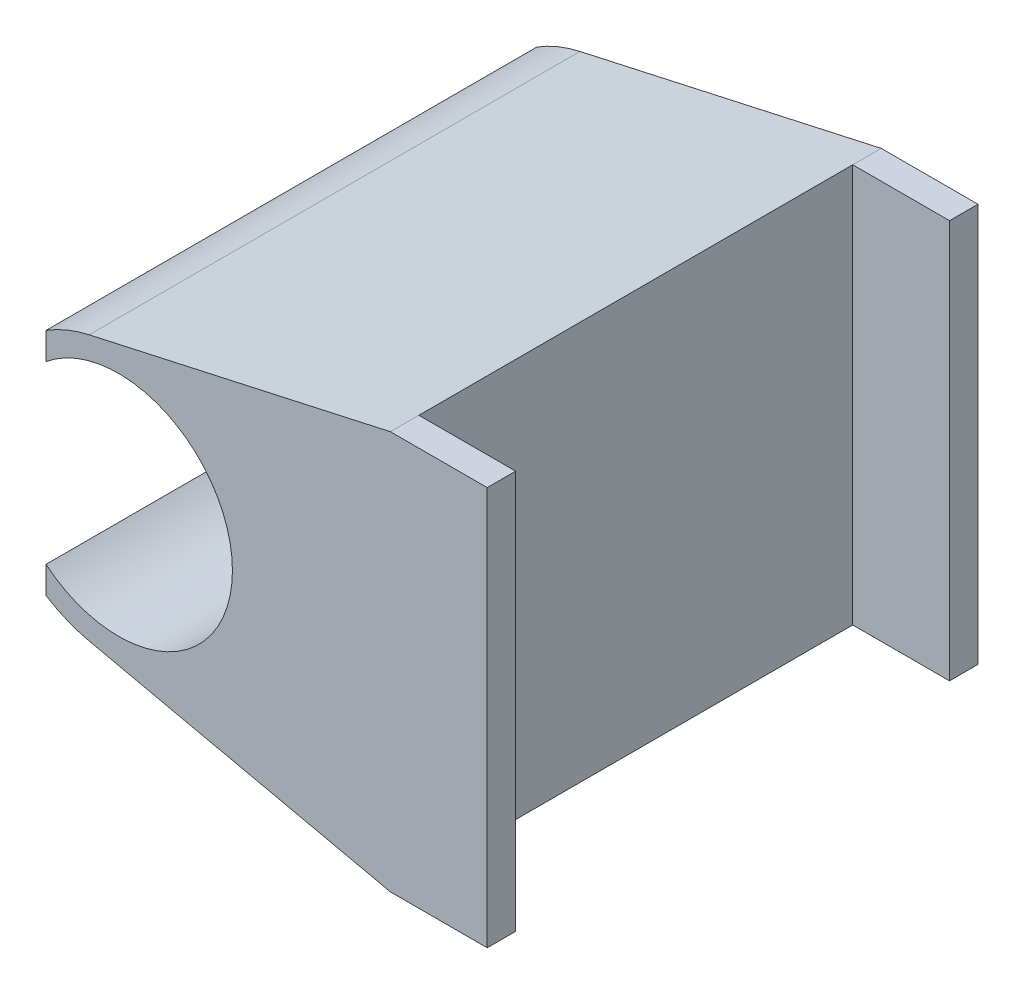
ISO-10303-21;
HEADER;
FILE_DESCRIPTION(('STEP AP214'),'2;1');
FILE_NAME('part.step','',(''),(''),'','','');
FILE_SCHEMA(('AUTOMOTIVE_DESIGN { 1 0 10303 214 1 1 1 1 }'));
ENDSEC;
DATA;
#1=APPLICATION_CONTEXT('core data for automotive mechanical design processes');
#2=APPLICATION_PROTOCOL_DEFINITION('international standard','automotive_design',2000,#1);
#3=PRODUCT_CONTEXT('',#1,'mechanical');
#4=PRODUCT('Part','Part','',(#3));
#5=PRODUCT_RELATED_PRODUCT_CATEGORY('part','',(#4));
#6=PRODUCT_DEFINITION_FORMATION('','',#4);
#7=PRODUCT_DEFINITION_CONTEXT('part definition',#1,'design');
#8=PRODUCT_DEFINITION('design','',#6,#7);
#9=PRODUCT_DEFINITION_SHAPE('','',#8);
#10=(LENGTH_UNIT() NAMED_UNIT(*) SI_UNIT(.MILLI.,.METRE.));
#11=(NAMED_UNIT(*) PLANE_ANGLE_UNIT() SI_UNIT($,.RADIAN.));
#12=(NAMED_UNIT(*) SI_UNIT($,.STERADIAN.) SOLID_ANGLE_UNIT());
#13=UNCERTAINTY_MEASURE_WITH_UNIT(LENGTH_MEASURE(1.E-05),#10,'distance_accuracy_value','');
#14=(GEOMETRIC_REPRESENTATION_CONTEXT(3) GLOBAL_UNCERTAINTY_ASSIGNED_CONTEXT((#13)) GLOBAL_UNIT_ASSIGNED_CONTEXT((#10,
#11,#12)) REPRESENTATION_CONTEXT('',''));
#15=CARTESIAN_POINT('',(0.,0.,0.));
#16=DIRECTION('',(0.,0.,1.));
#17=DIRECTION('',(1.,0.,0.));
#18=AXIS2_PLACEMENT_3D('',#15,#16,#17);
#19=CARTESIAN_POINT('',(0.,35.,-29.2719512195122));
#20=DIRECTION('',(0.,0.,1.));
#21=DIRECTION('',(1.,0.,0.));
#22=AXIS2_PLACEMENT_3D('',#19,#20,#21);
#23=PLANE('',#22);
#24=DIRECTION('',(0.976356305138745,-0.216167447632194,0.));
#25=VECTOR('',#24,1.);
#26=CARTESIAN_POINT('',(-0.397191106034449,-1.79397982892226,-29.2719512195122));
#27=LINE('',#26,#25);
#28=CARTESIAN_POINT('',(-34.9528481587726,5.85671914954375,-29.2719512195122));
#29=VERTEX_POINT('',#28);
#30=CARTESIAN_POINT('',(-8.50000000000001,0.,-29.2719512195122));
#31=VERTEX_POINT('',#30);
#32=EDGE_CURVE('E175',#29,#31,#27,.T.);
#33=ORIENTED_EDGE('',*,*,#32,.F.);
#34=CARTESIAN_POINT('',(-32.375,17.5,-29.2719512195122));
#35=DIRECTION('',(0.,0.,1.));
#36=DIRECTION('',(1.,0.,0.));
#37=AXIS2_PLACEMENT_3D('',#34,#35,#36);
#38=CIRCLE('',#37,11.9252375277094);
#39=CARTESIAN_POINT('',(-38.7462449709904,7.41939844989802,-29.2719512195122));
#40=VERTEX_POINT('',#39);
#41=EDGE_CURVE('E188',#40,#29,#38,.T.);
#42=ORIENTED_EDGE('',*,*,#41,.F.);
#43=DIRECTION('',(0.,1.,0.));
#44=VECTOR('',#43,1.);
#45=CARTESIAN_POINT('',(-38.7462449709904,0.,-29.2719512195122));
#46=LINE('',#45,#44);
#47=CARTESIAN_POINT('',(-38.7462449709904,9.79239093365331,-29.2719512195122));
#48=VERTEX_POINT('',#47);
#49=EDGE_CURVE('E190',#40,#48,#46,.T.);
#50=ORIENTED_EDGE('',*,*,#49,.T.);
#51=CARTESIAN_POINT('',(-32.375,17.5,-29.2719512195122));
#52=DIRECTION('',(0.,0.,1.));
#53=DIRECTION('',(1.,0.,0.));
#54=AXIS2_PLACEMENT_3D('',#51,#52,#53);
#55=CIRCLE('',#54,9.99999999999999);
#56=CARTESIAN_POINT('',(-38.7462449709904,25.2076090663467,-29.2719512195122));
#57=VERTEX_POINT('',#56);
#58=EDGE_CURVE('E193',#48,#57,#55,.T.);
#59=ORIENTED_EDGE('',*,*,#58,.T.);
#60=DIRECTION('',(0.,1.,0.));
#61=VECTOR('',#60,1.);
#62=CARTESIAN_POINT('',(-38.7462449709904,0.,-29.2719512195122));
#63=LINE('',#62,#61);
#64=CARTESIAN_POINT('',(-38.7462449709904,27.580601550102,-29.2719512195122));
#65=VERTEX_POINT('',#64);
#66=EDGE_CURVE('E166',#57,#65,#63,.T.);
#67=ORIENTED_EDGE('',*,*,#66,.T.);
#68=CARTESIAN_POINT('',(-32.375,17.5,-29.2719512195122));
#69=DIRECTION('',(0.,0.,1.));
#70=DIRECTION('',(1.,0.,0.));
#71=AXIS2_PLACEMENT_3D('',#68,#69,#70);
#72=CIRCLE('',#71,11.9252375277094);
#73=CARTESIAN_POINT('',(-34.9528481587726,29.1432808504563,-29.2719512195122));
#74=VERTEX_POINT('',#73);
#75=EDGE_CURVE('E159',#74,#65,#72,.T.);
#76=ORIENTED_EDGE('',*,*,#75,.F.);
#77=DIRECTION('',(0.976356305138745,0.216167447632194,0.));
#78=VECTOR('',#77,1.);
#79=CARTESIAN_POINT('',(-7.78416687218494,35.1584870393687,-29.2719512195122));
#80=LINE('',#79,#78);
#81=CARTESIAN_POINT('',(-8.49999999999991,35.,-29.2719512195122));
#82=VERTEX_POINT('',#81);
#83=EDGE_CURVE('E169',#74,#82,#80,.T.);
#84=ORIENTED_EDGE('',*,*,#83,.T.);
#85=DIRECTION('',(-1.,0.,0.));
#86=VECTOR('',#85,1.);
#87=CARTESIAN_POINT('',(0.,35.,-29.2719512195122));
#88=LINE('',#87,#86);
#89=CARTESIAN_POINT('',(0.,35.,-29.2719512195122));
#90=VERTEX_POINT('',#89);
#91=EDGE_CURVE('E227',#90,#82,#88,.T.);
#92=ORIENTED_EDGE('',*,*,#91,.F.);
#93=DIRECTION('',(0.,-1.,0.));
#94=VECTOR('',#93,1.);
#95=CARTESIAN_POINT('',(0.,35.,-29.2719512195122));
#96=LINE('',#95,#94);
#97=CARTESIAN_POINT('',(0.,0.,-29.2719512195122));
#98=VERTEX_POINT('',#97);
#99=EDGE_CURVE('E260',#90,#98,#96,.T.);
#100=ORIENTED_EDGE('',*,*,#99,.T.);
#101=DIRECTION('',(-1.,0.,0.));
#102=VECTOR('',#101,1.);
#103=CARTESIAN_POINT('',(0.,0.,-29.2719512195122));
#104=LINE('',#103,#102);
#105=EDGE_CURVE('E241',#98,#31,#104,.T.);
#106=ORIENTED_EDGE('',*,*,#105,.T.);
#107=EDGE_LOOP('',(#33,#42,#50,#59,#67,#76,#84,#92,#100,#106));
#108=FACE_BOUND('',#107,.T.);
#109=ADVANCED_FACE('F45',(#108),#23,.F.);
#110=CARTESIAN_POINT('',(-42.375,35.,13.8280487804878));
#111=DIRECTION('',(0.,0.,-1.));
#112=DIRECTION('',(-1.,0.,0.));
#113=AXIS2_PLACEMENT_3D('',#110,#111,#112);
#114=PLANE('',#113);
#115=DIRECTION('',(0.976356305138745,-0.216167447632194,0.));
#116=VECTOR('',#115,1.);
#117=CARTESIAN_POINT('',(-0.397191106034449,-1.79397982892226,13.8280487804878));
#118=LINE('',#117,#116);
#119=CARTESIAN_POINT('',(-34.9528481587726,5.85671914954375,13.8280487804878));
#120=VERTEX_POINT('',#119);
#121=CARTESIAN_POINT('',(-8.50000000000001,0.,13.8280487804878));
#122=VERTEX_POINT('',#121);
#123=EDGE_CURVE('E199',#120,#122,#118,.T.);
#124=ORIENTED_EDGE('',*,*,#123,.T.);
#125=DIRECTION('',(1.,0.,0.));
#126=VECTOR('',#125,1.);
#127=CARTESIAN_POINT('',(-42.375,0.,13.8280487804878));
#128=LINE('',#127,#126);
#129=CARTESIAN_POINT('',(0.,0.,13.8280487804878));
#130=VERTEX_POINT('',#129);
#131=EDGE_CURVE('E244',#122,#130,#128,.T.);
#132=ORIENTED_EDGE('',*,*,#131,.T.);
#133=DIRECTION('',(0.,-1.,0.));
#134=VECTOR('',#133,1.);
#135=CARTESIAN_POINT('',(0.,35.,13.8280487804878));
#136=LINE('',#135,#134);
#137=CARTESIAN_POINT('',(0.,35.,13.8280487804878));
#138=VERTEX_POINT('',#137);
#139=EDGE_CURVE('E258',#138,#130,#136,.T.);
#140=ORIENTED_EDGE('',*,*,#139,.F.);
#141=DIRECTION('',(1.,0.,0.));
#142=VECTOR('',#141,1.);
#143=CARTESIAN_POINT('',(-42.375,35.,13.8280487804878));
#144=LINE('',#143,#142);
#145=CARTESIAN_POINT('',(-8.49999999999991,35.,13.8280487804878));
#146=VERTEX_POINT('',#145);
#147=EDGE_CURVE('E229',#146,#138,#144,.T.);
#148=ORIENTED_EDGE('',*,*,#147,.F.);
#149=DIRECTION('',(0.976356305138745,0.216167447632194,0.));
#150=VECTOR('',#149,1.);
#151=CARTESIAN_POINT('',(-7.78416687218494,35.1584870393687,13.8280487804878));
#152=LINE('',#151,#150);
#153=CARTESIAN_POINT('',(-34.9528481587726,29.1432808504563,13.8280487804878));
#154=VERTEX_POINT('',#153);
#155=EDGE_CURVE('E197',#154,#146,#152,.T.);
#156=ORIENTED_EDGE('',*,*,#155,.F.);
#157=CARTESIAN_POINT('',(-32.375,17.5,13.8280487804878));
#158=DIRECTION('',(0.,0.,1.));
#159=DIRECTION('',(1.,0.,0.));
#160=AXIS2_PLACEMENT_3D('',#157,#158,#159);
#161=CIRCLE('',#160,11.9252375277094);
#162=CARTESIAN_POINT('',(-38.7462449709904,27.580601550102,13.8280487804878));
#163=VERTEX_POINT('',#162);
#164=EDGE_CURVE('E162',#154,#163,#161,.T.);
#165=ORIENTED_EDGE('',*,*,#164,.T.);
#166=DIRECTION('',(0.,1.,0.));
#167=VECTOR('',#166,1.);
#168=CARTESIAN_POINT('',(-38.7462449709904,0.,13.8280487804878));
#169=LINE('',#168,#167);
#170=CARTESIAN_POINT('',(-38.7462449709904,25.2076090663467,13.8280487804878));
#171=VERTEX_POINT('',#170);
#172=EDGE_CURVE('E181',#171,#163,#169,.T.);
#173=ORIENTED_EDGE('',*,*,#172,.F.);
#174=CARTESIAN_POINT('',(-32.375,17.5,13.8280487804878));
#175=DIRECTION('',(0.,0.,1.));
#176=DIRECTION('',(1.,0.,0.));
#177=AXIS2_PLACEMENT_3D('',#174,#175,#176);
#178=CIRCLE('',#177,9.99999999999999);
#179=CARTESIAN_POINT('',(-38.7462449709904,9.79239093365331,13.8280487804878));
#180=VERTEX_POINT('',#179);
#181=EDGE_CURVE('E184',#180,#171,#178,.T.);
#182=ORIENTED_EDGE('',*,*,#181,.F.);
#183=DIRECTION('',(0.,1.,0.));
#184=VECTOR('',#183,1.);
#185=CARTESIAN_POINT('',(-38.7462449709904,0.,13.8280487804878));
#186=LINE('',#185,#184);
#187=CARTESIAN_POINT('',(-38.7462449709904,7.41939844989802,13.8280487804878));
#188=VERTEX_POINT('',#187);
#189=EDGE_CURVE('E205',#188,#180,#186,.T.);
#190=ORIENTED_EDGE('',*,*,#189,.F.);
#191=CARTESIAN_POINT('',(-32.375,17.5,13.8280487804878));
#192=DIRECTION('',(0.,0.,1.));
#193=DIRECTION('',(1.,0.,0.));
#194=AXIS2_PLACEMENT_3D('',#191,#192,#193);
#195=CIRCLE('',#194,11.9252375277094);
#196=EDGE_CURVE('E202',#188,#120,#195,.T.);
#197=ORIENTED_EDGE('',*,*,#196,.T.);
#198=EDGE_LOOP('',(#124,#132,#140,#148,#156,#165,#173,#182,#190,#197));
#199=FACE_BOUND('',#198,.T.);
#200=ADVANCED_FACE('F271',(#199),#114,.F.);
#201=CARTESIAN_POINT('',(0.,35.,0.));
#202=DIRECTION('',(0.,1.,0.));
#203=DIRECTION('',(0.,0.,1.));
#204=AXIS2_PLACEMENT_3D('',#201,#202,#203);
#205=PLANE('',#204);
#206=DIRECTION('',(0.,0.,-1.));
#207=VECTOR('',#206,1.);
#208=CARTESIAN_POINT('',(-8.49999999999999,35.,0.));
#209=LINE('',#208,#207);
#210=CARTESIAN_POINT('',(-8.49999999999991,35.,11.3280487804878));
#211=VERTEX_POINT('',#210);
#212=EDGE_CURVE('E11',#146,#211,#209,.T.);
#213=ORIENTED_EDGE('',*,*,#212,.F.);
#214=ORIENTED_EDGE('',*,*,#147,.T.);
#215=DIRECTION('',(0.,0.,-1.));
#216=VECTOR('',#215,1.);
#217=CARTESIAN_POINT('',(0.,35.,13.8280487804878));
#218=LINE('',#217,#216);
#219=CARTESIAN_POINT('',(0.,35.,11.3280487804878));
#220=VERTEX_POINT('',#219);
#221=EDGE_CURVE('E62',#138,#220,#218,.T.);
#222=ORIENTED_EDGE('',*,*,#221,.T.);
#223=DIRECTION('',(-1.,0.,0.));
#224=VECTOR('',#223,1.);
#225=CARTESIAN_POINT('',(0.,35.,11.3280487804878));
#226=LINE('',#225,#224);
#227=EDGE_CURVE('E232',#220,#211,#226,.T.);
#228=ORIENTED_EDGE('',*,*,#227,.T.);
#229=EDGE_LOOP('',(#213,#214,#222,#228));
#230=FACE_BOUND('',#229,.T.);
#231=ADVANCED_FACE('F308',(#230),#205,.T.);
#232=CARTESIAN_POINT('',(0.,0.,0.));
#233=DIRECTION('',(0.,1.,0.));
#234=DIRECTION('',(0.,0.,1.));
#235=AXIS2_PLACEMENT_3D('',#232,#233,#234);
#236=PLANE('',#235);
#237=DIRECTION('',(0.,0.,1.));
#238=VECTOR('',#237,1.);
#239=CARTESIAN_POINT('',(-8.50000000000001,0.,-29.2719512195122));
#240=LINE('',#239,#238);
#241=CARTESIAN_POINT('',(-8.50000000000001,0.,-26.7719512195122));
#242=VERTEX_POINT('',#241);
#243=EDGE_CURVE('E221',#31,#242,#240,.T.);
#244=ORIENTED_EDGE('',*,*,#243,.F.);
#245=ORIENTED_EDGE('',*,*,#105,.F.);
#246=DIRECTION('',(0.,0.,-1.));
#247=VECTOR('',#246,1.);
#248=CARTESIAN_POINT('',(0.,0.,-26.7719512195122));
#249=LINE('',#248,#247);
#250=CARTESIAN_POINT('',(0.,0.,-26.7719512195122));
#251=VERTEX_POINT('',#250);
#252=EDGE_CURVE('E239',#251,#98,#249,.T.);
#253=ORIENTED_EDGE('',*,*,#252,.F.);
#254=DIRECTION('',(1.,0.,0.));
#255=VECTOR('',#254,1.);
#256=CARTESIAN_POINT('',(-8.5,0.,-26.7719512195122));
#257=LINE('',#256,#255);
#258=EDGE_CURVE('E212',#242,#251,#257,.T.);
#259=ORIENTED_EDGE('',*,*,#258,.F.);
#260=EDGE_LOOP('',(#244,#245,#253,#259));
#261=FACE_BOUND('',#260,.T.);
#262=ADVANCED_FACE('F292',(#261),#236,.F.);
#263=DIRECTION('',(0.,0.,1.));
#264=VECTOR('',#263,1.);
#265=CARTESIAN_POINT('',(-8.50000000000001,0.,0.));
#266=LINE('',#265,#264);
#267=CARTESIAN_POINT('',(-8.5,0.,11.3280487804878));
#268=VERTEX_POINT('',#267);
#269=EDGE_CURVE('E54',#268,#122,#266,.T.);
#270=ORIENTED_EDGE('',*,*,#269,.F.);
#271=DIRECTION('',(-1.,0.,0.));
#272=VECTOR('',#271,1.);
#273=CARTESIAN_POINT('',(0.,0.,11.3280487804878));
#274=LINE('',#273,#272);
#275=CARTESIAN_POINT('',(0.,0.,11.3280487804878));
#276=VERTEX_POINT('',#275);
#277=EDGE_CURVE('E247',#276,#268,#274,.T.);
#278=ORIENTED_EDGE('',*,*,#277,.F.);
#279=DIRECTION('',(0.,0.,-1.));
#280=VECTOR('',#279,1.);
#281=CARTESIAN_POINT('',(0.,0.,13.8280487804878));
#282=LINE('',#281,#280);
#283=EDGE_CURVE('E82',#130,#276,#282,.T.);
#284=ORIENTED_EDGE('',*,*,#283,.F.);
#285=ORIENTED_EDGE('',*,*,#131,.F.);
#286=EDGE_LOOP('',(#270,#278,#284,#285));
#287=FACE_BOUND('',#286,.T.);
#288=ADVANCED_FACE('F275',(#287),#236,.F.);
#289=CARTESIAN_POINT('',(-8.5,35.,-26.7719512195122));
#290=DIRECTION('',(0.,0.,-1.));
#291=DIRECTION('',(-1.,0.,0.));
#292=AXIS2_PLACEMENT_3D('',#289,#290,#291);
#293=PLANE('',#292);
#294=ORIENTED_EDGE('',*,*,#258,.T.);
#295=DIRECTION('',(0.,-1.,0.));
#296=VECTOR('',#295,1.);
#297=CARTESIAN_POINT('',(0.,35.,-26.7719512195122));
#298=LINE('',#297,#296);
#299=CARTESIAN_POINT('',(0.,35.,-26.7719512195122));
#300=VERTEX_POINT('',#299);
#301=EDGE_CURVE('E263',#300,#251,#298,.T.);
#302=ORIENTED_EDGE('',*,*,#301,.F.);
#303=DIRECTION('',(1.,0.,0.));
#304=VECTOR('',#303,1.);
#305=CARTESIAN_POINT('',(-8.5,35.,-26.7719512195122));
#306=LINE('',#305,#304);
#307=CARTESIAN_POINT('',(-8.49999999999991,35.,-26.7719512195122));
#308=VERTEX_POINT('',#307);
#309=EDGE_CURVE('E224',#308,#300,#306,.T.);
#310=ORIENTED_EDGE('',*,*,#309,.F.);
#311=DIRECTION('',(0.,-1.,0.));
#312=VECTOR('',#311,1.);
#313=CARTESIAN_POINT('',(-8.5,35.,-26.7719512195122));
#314=LINE('',#313,#312);
#315=EDGE_CURVE('E236',#308,#242,#314,.T.);
#316=ORIENTED_EDGE('',*,*,#315,.T.);
#317=EDGE_LOOP('',(#294,#302,#310,#316));
#318=FACE_BOUND('',#317,.T.);
#319=ADVANCED_FACE('F47',(#318),#293,.F.);
#320=CARTESIAN_POINT('',(0.,35.,-26.7719512195122));
#321=DIRECTION('',(-1.,0.,0.));
#322=DIRECTION('',(0.,0.,1.));
#323=AXIS2_PLACEMENT_3D('',#320,#321,#322);
#324=PLANE('',#323);
#325=ORIENTED_EDGE('',*,*,#252,.T.);
#326=ORIENTED_EDGE('',*,*,#99,.F.);
#327=DIRECTION('',(0.,0.,-1.));
#328=VECTOR('',#327,1.);
#329=CARTESIAN_POINT('',(0.,35.,-26.7719512195122));
#330=LINE('',#329,#328);
#331=EDGE_CURVE('E98',#300,#90,#330,.T.);
#332=ORIENTED_EDGE('',*,*,#331,.F.);
#333=ORIENTED_EDGE('',*,*,#301,.T.);
#334=EDGE_LOOP('',(#325,#326,#332,#333));
#335=FACE_BOUND('',#334,.T.);
#336=ADVANCED_FACE('F311',(#335),#324,.F.);
#337=CARTESIAN_POINT('',(0.,35.,13.8280487804878));
#338=DIRECTION('',(-1.,0.,0.));
#339=DIRECTION('',(0.,0.,1.));
#340=AXIS2_PLACEMENT_3D('',#337,#338,#339);
#341=PLANE('',#340);
#342=ORIENTED_EDGE('',*,*,#283,.T.);
#343=DIRECTION('',(0.,-1.,0.));
#344=VECTOR('',#343,1.);
#345=CARTESIAN_POINT('',(0.,35.,11.3280487804878));
#346=LINE('',#345,#344);
#347=EDGE_CURVE('E256',#220,#276,#346,.T.);
#348=ORIENTED_EDGE('',*,*,#347,.F.);
#349=ORIENTED_EDGE('',*,*,#221,.F.);
#350=ORIENTED_EDGE('',*,*,#139,.T.);
#351=EDGE_LOOP('',(#342,#348,#349,#350));
#352=FACE_BOUND('',#351,.T.);
#353=ADVANCED_FACE('F309',(#352),#341,.F.);
#354=CARTESIAN_POINT('',(0.,35.,11.3280487804878));
#355=DIRECTION('',(0.,0.,1.));
#356=DIRECTION('',(1.,0.,0.));
#357=AXIS2_PLACEMENT_3D('',#354,#355,#356);
#358=PLANE('',#357);
#359=ORIENTED_EDGE('',*,*,#277,.T.);
#360=DIRECTION('',(0.,-1.,0.));
#361=VECTOR('',#360,1.);
#362=CARTESIAN_POINT('',(-8.5,35.,11.3280487804878));
#363=LINE('',#362,#361);
#364=EDGE_CURVE('E253',#211,#268,#363,.T.);
#365=ORIENTED_EDGE('',*,*,#364,.F.);
#366=ORIENTED_EDGE('',*,*,#227,.F.);
#367=ORIENTED_EDGE('',*,*,#347,.T.);
#368=EDGE_LOOP('',(#359,#365,#366,#367));
#369=FACE_BOUND('',#368,.T.);
#370=ADVANCED_FACE('F278',(#369),#358,.F.);
#371=CARTESIAN_POINT('',(-8.5,35.,11.3280487804878));
#372=DIRECTION('',(-1.,0.,0.));
#373=DIRECTION('',(0.,0.,1.));
#374=AXIS2_PLACEMENT_3D('',#371,#372,#373);
#375=PLANE('',#374);
#376=DIRECTION('',(0.,0.,-1.));
#377=VECTOR('',#376,1.);
#378=CARTESIAN_POINT('',(-8.5,0.,11.3280487804878));
#379=LINE('',#378,#377);
#380=EDGE_CURVE('E90',#268,#242,#379,.T.);
#381=ORIENTED_EDGE('',*,*,#380,.T.);
#382=ORIENTED_EDGE('',*,*,#315,.F.);
#383=DIRECTION('',(0.,0.,-1.));
#384=VECTOR('',#383,1.);
#385=CARTESIAN_POINT('',(-8.5,35.,11.3280487804878));
#386=LINE('',#385,#384);
#387=EDGE_CURVE('E234',#211,#308,#386,.T.);
#388=ORIENTED_EDGE('',*,*,#387,.F.);
#389=ORIENTED_EDGE('',*,*,#364,.T.);
#390=EDGE_LOOP('',(#381,#382,#388,#389));
#391=FACE_BOUND('',#390,.T.);
#392=ADVANCED_FACE('F282',(#391),#375,.F.);
#393=DIRECTION('',(0.,0.,1.));
#394=VECTOR('',#393,1.);
#395=CARTESIAN_POINT('',(-8.49999999999991,35.,-29.2719512195122));
#396=LINE('',#395,#394);
#397=EDGE_CURVE('E165',#82,#308,#396,.T.);
#398=ORIENTED_EDGE('',*,*,#397,.T.);
#399=ORIENTED_EDGE('',*,*,#309,.T.);
#400=ORIENTED_EDGE('',*,*,#331,.T.);
#401=ORIENTED_EDGE('',*,*,#91,.T.);
#402=EDGE_LOOP('',(#398,#399,#400,#401));
#403=FACE_BOUND('',#402,.T.);
#404=ADVANCED_FACE('F287',(#403),#205,.T.);
#405=CARTESIAN_POINT('',(-32.375,17.5,-29.2719512195122));
#406=DIRECTION('',(0.,0.,1.));
#407=DIRECTION('',(1.,0.,0.));
#408=AXIS2_PLACEMENT_3D('',#405,#406,#407);
#409=CYLINDRICAL_SURFACE('',#408,11.9252375277094);
#410=ORIENTED_EDGE('',*,*,#164,.F.);
#411=DIRECTION('',(0.,0.,1.));
#412=VECTOR('',#411,1.);
#413=CARTESIAN_POINT('',(-34.9528481587726,29.1432808504563,-29.2719512195122));
#414=LINE('',#413,#412);
#415=EDGE_CURVE('E155',#74,#154,#414,.T.);
#416=ORIENTED_EDGE('',*,*,#415,.F.);
#417=ORIENTED_EDGE('',*,*,#75,.T.);
#418=DIRECTION('',(0.,0.,1.));
#419=VECTOR('',#418,1.);
#420=CARTESIAN_POINT('',(-38.7462449709904,27.580601550102,-29.2719512195122));
#421=LINE('',#420,#419);
#422=EDGE_CURVE('E210',#65,#163,#421,.T.);
#423=ORIENTED_EDGE('',*,*,#422,.T.);
#424=EDGE_LOOP('',(#410,#416,#417,#423));
#425=FACE_BOUND('',#424,.T.);
#426=ADVANCED_FACE('F157',(#425),#409,.T.);
#427=CARTESIAN_POINT('',(-38.7462449709904,0.,-29.2719512195122));
#428=DIRECTION('',(1.,0.,0.));
#429=DIRECTION('',(0.,0.,-1.));
#430=AXIS2_PLACEMENT_3D('',#427,#428,#429);
#431=PLANE('',#430);
#432=ORIENTED_EDGE('',*,*,#172,.T.);
#433=ORIENTED_EDGE('',*,*,#422,.F.);
#434=ORIENTED_EDGE('',*,*,#66,.F.);
#435=DIRECTION('',(0.,0.,1.));
#436=VECTOR('',#435,1.);
#437=CARTESIAN_POINT('',(-38.7462449709904,25.2076090663467,-29.2719512195122));
#438=LINE('',#437,#436);
#439=EDGE_CURVE('E213',#57,#171,#438,.T.);
#440=ORIENTED_EDGE('',*,*,#439,.T.);
#441=EDGE_LOOP('',(#432,#433,#434,#440));
#442=FACE_BOUND('',#441,.T.);
#443=ADVANCED_FACE('F306',(#442),#431,.F.);
#444=CARTESIAN_POINT('',(-32.375,17.5,-29.2719512195122));
#445=DIRECTION('',(0.,0.,1.));
#446=DIRECTION('',(1.,0.,0.));
#447=AXIS2_PLACEMENT_3D('',#444,#445,#446);
#448=CYLINDRICAL_SURFACE('',#447,9.99999999999999);
#449=ORIENTED_EDGE('',*,*,#181,.T.);
#450=ORIENTED_EDGE('',*,*,#439,.F.);
#451=ORIENTED_EDGE('',*,*,#58,.F.);
#452=DIRECTION('',(0.,0.,1.));
#453=VECTOR('',#452,1.);
#454=CARTESIAN_POINT('',(-38.7462449709904,9.79239093365331,-29.2719512195122));
#455=LINE('',#454,#453);
#456=EDGE_CURVE('E215',#48,#180,#455,.T.);
#457=ORIENTED_EDGE('',*,*,#456,.T.);
#458=EDGE_LOOP('',(#449,#450,#451,#457));
#459=FACE_BOUND('',#458,.T.);
#460=ADVANCED_FACE('F303',(#459),#448,.F.);
#461=CARTESIAN_POINT('',(-38.7462449709904,0.,-29.2719512195122));
#462=DIRECTION('',(1.,0.,0.));
#463=DIRECTION('',(0.,0.,-1.));
#464=AXIS2_PLACEMENT_3D('',#461,#462,#463);
#465=PLANE('',#464);
#466=ORIENTED_EDGE('',*,*,#189,.T.);
#467=ORIENTED_EDGE('',*,*,#456,.F.);
#468=ORIENTED_EDGE('',*,*,#49,.F.);
#469=DIRECTION('',(0.,0.,1.));
#470=VECTOR('',#469,1.);
#471=CARTESIAN_POINT('',(-38.7462449709904,7.41939844989802,-29.2719512195122));
#472=LINE('',#471,#470);
#473=EDGE_CURVE('E217',#40,#188,#472,.T.);
#474=ORIENTED_EDGE('',*,*,#473,.T.);
#475=EDGE_LOOP('',(#466,#467,#468,#474));
#476=FACE_BOUND('',#475,.T.);
#477=ADVANCED_FACE('F299',(#476),#465,.F.);
#478=CARTESIAN_POINT('',(-32.375,17.5,-29.2719512195122));
#479=DIRECTION('',(0.,0.,1.));
#480=DIRECTION('',(1.,0.,0.));
#481=AXIS2_PLACEMENT_3D('',#478,#479,#480);
#482=CYLINDRICAL_SURFACE('',#481,11.9252375277094);
#483=ORIENTED_EDGE('',*,*,#196,.F.);
#484=ORIENTED_EDGE('',*,*,#473,.F.);
#485=ORIENTED_EDGE('',*,*,#41,.T.);
#486=DIRECTION('',(0.,0.,1.));
#487=VECTOR('',#486,1.);
#488=CARTESIAN_POINT('',(-34.9528481587726,5.85671914954375,-29.2719512195122));
#489=LINE('',#488,#487);
#490=EDGE_CURVE('E219',#29,#120,#489,.T.);
#491=ORIENTED_EDGE('',*,*,#490,.T.);
#492=EDGE_LOOP('',(#483,#484,#485,#491));
#493=FACE_BOUND('',#492,.T.);
#494=ADVANCED_FACE('F297',(#493),#482,.T.);
#495=CARTESIAN_POINT('',(-0.397191106034449,-1.79397982892226,-29.2719512195122));
#496=DIRECTION('',(-0.216167447632194,-0.976356305138745,0.));
#497=DIRECTION('',(0.976356305138745,-0.216167447632194,0.));
#498=AXIS2_PLACEMENT_3D('',#495,#496,#497);
#499=PLANE('',#498);
#500=ORIENTED_EDGE('',*,*,#123,.F.);
#501=ORIENTED_EDGE('',*,*,#490,.F.);
#502=ORIENTED_EDGE('',*,*,#32,.T.);
#503=ORIENTED_EDGE('',*,*,#243,.T.);
#504=ORIENTED_EDGE('',*,*,#380,.F.);
#505=ORIENTED_EDGE('',*,*,#269,.T.);
#506=EDGE_LOOP('',(#500,#501,#502,#503,#504,#505));
#507=FACE_BOUND('',#506,.T.);
#508=ADVANCED_FACE('F265',(#507),#499,.T.);
#509=CARTESIAN_POINT('',(-7.78416687218494,35.1584870393687,-29.2719512195122));
#510=DIRECTION('',(0.216167447632194,-0.976356305138745,0.));
#511=DIRECTION('',(0.976356305138745,0.216167447632194,0.));
#512=AXIS2_PLACEMENT_3D('',#509,#510,#511);
#513=PLANE('',#512);
#514=ORIENTED_EDGE('',*,*,#155,.T.);
#515=ORIENTED_EDGE('',*,*,#212,.T.);
#516=ORIENTED_EDGE('',*,*,#387,.T.);
#517=ORIENTED_EDGE('',*,*,#397,.F.);
#518=ORIENTED_EDGE('',*,*,#83,.F.);
#519=ORIENTED_EDGE('',*,*,#415,.T.);
#520=EDGE_LOOP('',(#514,#515,#516,#517,#518,#519));
#521=FACE_BOUND('',#520,.T.);
#522=ADVANCED_FACE('F170',(#521),#513,.F.);
#523=CLOSED_SHELL('',(#109,#200,#231,#262,#288,#319,#336,#353,#370,#392,#404,#426,#443,#460,
#477,#494,#508,#522));
#524=MANIFOLD_SOLID_BREP('B2',#523);
#525=ADVANCED_BREP_SHAPE_REPRESENTATION('',(#18,#524),#14);
#526=SHAPE_DEFINITION_REPRESENTATION(#9,#525);
ENDSEC;
END-ISO-10303-21;
